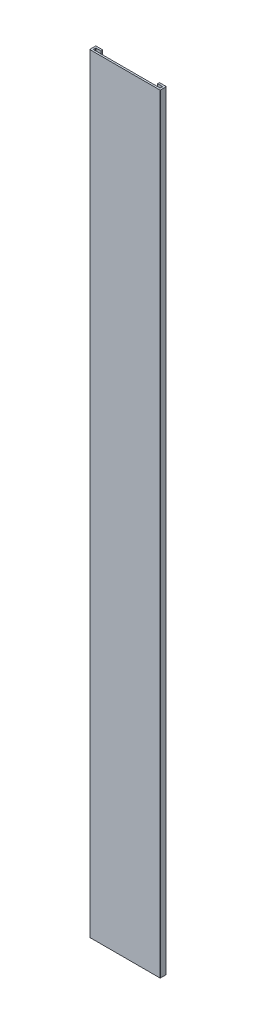
ISO-10303-21;
HEADER;
FILE_DESCRIPTION(('STEP AP214'),'2;1');
FILE_NAME('part.step','',(''),(''),'','','');
FILE_SCHEMA(('AUTOMOTIVE_DESIGN { 1 0 10303 214 1 1 1 1 }'));
ENDSEC;
DATA;
#1=APPLICATION_CONTEXT('core data for automotive mechanical design processes');
#2=APPLICATION_PROTOCOL_DEFINITION('international standard','automotive_design',2000,#1);
#3=PRODUCT_CONTEXT('',#1,'mechanical');
#4=PRODUCT('Part','Part','',(#3));
#5=PRODUCT_RELATED_PRODUCT_CATEGORY('part','',(#4));
#6=PRODUCT_DEFINITION_FORMATION('','',#4);
#7=PRODUCT_DEFINITION_CONTEXT('part definition',#1,'design');
#8=PRODUCT_DEFINITION('design','',#6,#7);
#9=PRODUCT_DEFINITION_SHAPE('','',#8);
#10=(LENGTH_UNIT() NAMED_UNIT(*) SI_UNIT(.MILLI.,.METRE.));
#11=(NAMED_UNIT(*) PLANE_ANGLE_UNIT() SI_UNIT($,.RADIAN.));
#12=(NAMED_UNIT(*) SI_UNIT($,.STERADIAN.) SOLID_ANGLE_UNIT());
#13=UNCERTAINTY_MEASURE_WITH_UNIT(LENGTH_MEASURE(1.E-05),#10,'distance_accuracy_value','');
#14=(GEOMETRIC_REPRESENTATION_CONTEXT(3) GLOBAL_UNCERTAINTY_ASSIGNED_CONTEXT((#13)) GLOBAL_UNIT_ASSIGNED_CONTEXT((#10,
#11,#12)) REPRESENTATION_CONTEXT('',''));
#15=CARTESIAN_POINT('',(0.,0.,0.));
#16=DIRECTION('',(0.,0.,1.));
#17=DIRECTION('',(1.,0.,0.));
#18=AXIS2_PLACEMENT_3D('',#15,#16,#17);
#19=CARTESIAN_POINT('',(17.6613086008675,1000.,2.65));
#20=DIRECTION('',(0.,-1.,0.));
#21=DIRECTION('',(0.,0.,-1.));
#22=AXIS2_PLACEMENT_3D('',#19,#20,#21);
#23=CYLINDRICAL_SURFACE('',#22,0.2);
#24=CARTESIAN_POINT('',(17.6613086008675,423.,2.65));
#25=DIRECTION('',(0.,-1.,0.));
#26=DIRECTION('',(1.,0.,0.));
#27=AXIS2_PLACEMENT_3D('',#24,#25,#26);
#28=CIRCLE('',#27,0.2);
#29=CARTESIAN_POINT('',(17.6613086008675,423.,2.85000000000001));
#30=VERTEX_POINT('',#29);
#31=CARTESIAN_POINT('',(17.8613086008675,423.,2.65));
#32=VERTEX_POINT('',#31);
#33=EDGE_CURVE('E68',#30,#32,#28,.F.);
#34=ORIENTED_EDGE('',*,*,#33,.F.);
#35=DIRECTION('',(0.,-1.,0.));
#36=VECTOR('',#35,1.);
#37=CARTESIAN_POINT('',(17.6613086008675,1000.,2.85));
#38=LINE('',#37,#36);
#39=CARTESIAN_POINT('',(17.6613086008675,0.,2.85));
#40=VERTEX_POINT('',#39);
#41=EDGE_CURVE('E62',#30,#40,#38,.T.);
#42=ORIENTED_EDGE('',*,*,#41,.T.);
#43=CARTESIAN_POINT('',(17.6613086008675,0.,2.65));
#44=DIRECTION('',(0.,-1.,0.));
#45=DIRECTION('',(-1.,0.,0.));
#46=AXIS2_PLACEMENT_3D('',#43,#44,#45);
#47=CIRCLE('',#46,0.2);
#48=CARTESIAN_POINT('',(17.8613086008675,0.,2.65));
#49=VERTEX_POINT('',#48);
#50=EDGE_CURVE('E307',#49,#40,#47,.T.);
#51=ORIENTED_EDGE('',*,*,#50,.F.);
#52=DIRECTION('',(0.,-1.,0.));
#53=VECTOR('',#52,1.);
#54=CARTESIAN_POINT('',(17.8613086008675,1000.,2.65));
#55=LINE('',#54,#53);
#56=EDGE_CURVE('E75',#32,#49,#55,.T.);
#57=ORIENTED_EDGE('',*,*,#56,.F.);
#58=EDGE_LOOP('',(#34,#42,#51,#57));
#59=FACE_BOUND('',#58,.T.);
#60=ADVANCED_FACE('F54',(#59),#23,.T.);
#61=CARTESIAN_POINT('',(17.6613086008675,1000.,2.85));
#62=DIRECTION('',(0.,0.,1.));
#63=DIRECTION('',(1.,0.,0.));
#64=AXIS2_PLACEMENT_3D('',#61,#62,#63);
#65=PLANE('',#64);
#66=DIRECTION('',(1.,0.,0.));
#67=VECTOR('',#66,1.);
#68=CARTESIAN_POINT('',(-247.339658226937,423.,2.85000000000001));
#69=LINE('',#68,#67);
#70=CARTESIAN_POINT('',(-20.7365535308051,423.,2.85000000000001));
#71=VERTEX_POINT('',#70);
#72=EDGE_CURVE('E216',#71,#30,#69,.T.);
#73=ORIENTED_EDGE('',*,*,#72,.F.);
#74=DIRECTION('',(0.,-1.,0.));
#75=VECTOR('',#74,1.);
#76=CARTESIAN_POINT('',(-20.7365535308051,1000.,2.85));
#77=LINE('',#76,#75);
#78=CARTESIAN_POINT('',(-20.7365535308051,0.,2.85));
#79=VERTEX_POINT('',#78);
#80=EDGE_CURVE('E228',#71,#79,#77,.T.);
#81=ORIENTED_EDGE('',*,*,#80,.T.);
#82=DIRECTION('',(-1.,0.,0.));
#83=VECTOR('',#82,1.);
#84=CARTESIAN_POINT('',(17.6613086008675,0.,2.85));
#85=LINE('',#84,#83);
#86=EDGE_CURVE('E311',#40,#79,#85,.T.);
#87=ORIENTED_EDGE('',*,*,#86,.F.);
#88=ORIENTED_EDGE('',*,*,#41,.F.);
#89=EDGE_LOOP('',(#73,#81,#87,#88));
#90=FACE_BOUND('',#89,.T.);
#91=ADVANCED_FACE('F226',(#90),#65,.T.);
#92=CARTESIAN_POINT('',(-20.7365535308051,1000.,2.6478621316727));
#93=DIRECTION('',(0.,-1.,0.));
#94=DIRECTION('',(0.,0.,-1.));
#95=AXIS2_PLACEMENT_3D('',#92,#93,#94);
#96=CYLINDRICAL_SURFACE('',#95,0.202137868327308);
#97=CARTESIAN_POINT('',(-20.7365535308051,423.,2.6478621316727));
#98=DIRECTION('',(0.,-1.,0.));
#99=DIRECTION('',(1.,0.,0.));
#100=AXIS2_PLACEMENT_3D('',#97,#98,#99);
#101=CIRCLE('',#100,0.202137868327308);
#102=CARTESIAN_POINT('',(-20.9386913991324,423.,2.6478621316727));
#103=VERTEX_POINT('',#102);
#104=EDGE_CURVE('E213',#103,#71,#101,.F.);
#105=ORIENTED_EDGE('',*,*,#104,.F.);
#106=DIRECTION('',(0.,-1.,0.));
#107=VECTOR('',#106,1.);
#108=CARTESIAN_POINT('',(-20.9386913991324,1000.,2.6478621316727));
#109=LINE('',#108,#107);
#110=CARTESIAN_POINT('',(-20.9386913991324,0.,2.6478621316727));
#111=VERTEX_POINT('',#110);
#112=EDGE_CURVE('E238',#103,#111,#109,.T.);
#113=ORIENTED_EDGE('',*,*,#112,.T.);
#114=CARTESIAN_POINT('',(-20.7365535308051,0.,2.6478621316727));
#115=DIRECTION('',(0.,-1.,0.));
#116=DIRECTION('',(1.,0.,0.));
#117=AXIS2_PLACEMENT_3D('',#114,#115,#116);
#118=CIRCLE('',#117,0.202137868327308);
#119=EDGE_CURVE('E235',#79,#111,#118,.T.);
#120=ORIENTED_EDGE('',*,*,#119,.F.);
#121=ORIENTED_EDGE('',*,*,#80,.F.);
#122=EDGE_LOOP('',(#105,#113,#120,#121));
#123=FACE_BOUND('',#122,.T.);
#124=ADVANCED_FACE('F233',(#123),#96,.T.);
#125=CARTESIAN_POINT('',(-20.9386913991324,1000.,2.6478621316727));
#126=DIRECTION('',(-1.,0.,0.));
#127=DIRECTION('',(0.,0.,1.));
#128=AXIS2_PLACEMENT_3D('',#125,#126,#127);
#129=PLANE('',#128);
#130=DIRECTION('',(0.,0.,1.));
#131=VECTOR('',#130,1.);
#132=CARTESIAN_POINT('',(-20.9386913991324,423.,2.6478621316727));
#133=LINE('',#132,#131);
#134=CARTESIAN_POINT('',(-20.9386913991324,423.,-0.350017840413514));
#135=VERTEX_POINT('',#134);
#136=EDGE_CURVE('E218',#135,#103,#133,.T.);
#137=ORIENTED_EDGE('',*,*,#136,.F.);
#138=DIRECTION('',(0.,-1.,0.));
#139=VECTOR('',#138,1.);
#140=CARTESIAN_POINT('',(-20.9386913991324,1000.,-0.350017840413514));
#141=LINE('',#140,#139);
#142=CARTESIAN_POINT('',(-20.9386913991324,0.,-0.350017840413514));
#143=VERTEX_POINT('',#142);
#144=EDGE_CURVE('E242',#135,#143,#141,.T.);
#145=ORIENTED_EDGE('',*,*,#144,.T.);
#146=DIRECTION('',(0.,0.,-1.));
#147=VECTOR('',#146,1.);
#148=CARTESIAN_POINT('',(-20.9386913991324,0.,2.6478621316727));
#149=LINE('',#148,#147);
#150=EDGE_CURVE('E390',#111,#143,#149,.T.);
#151=ORIENTED_EDGE('',*,*,#150,.F.);
#152=ORIENTED_EDGE('',*,*,#112,.F.);
#153=EDGE_LOOP('',(#137,#145,#151,#152));
#154=FACE_BOUND('',#153,.T.);
#155=ADVANCED_FACE('F556',(#154),#129,.T.);
#156=CARTESIAN_POINT('',(-20.7386913991324,1000.,-0.350017840413514));
#157=DIRECTION('',(0.,-1.,0.));
#158=DIRECTION('',(0.,0.,-1.));
#159=AXIS2_PLACEMENT_3D('',#156,#157,#158);
#160=CYLINDRICAL_SURFACE('',#159,0.2);
#161=CARTESIAN_POINT('',(-20.7386913991324,423.,-0.350017840413514));
#162=DIRECTION('',(0.,-1.,0.));
#163=DIRECTION('',(1.,0.,0.));
#164=AXIS2_PLACEMENT_3D('',#161,#162,#163);
#165=CIRCLE('',#164,0.2);
#166=CARTESIAN_POINT('',(-20.7387092403416,423.,-0.550017839617743));
#167=VERTEX_POINT('',#166);
#168=EDGE_CURVE('E402',#167,#135,#165,.F.);
#169=ORIENTED_EDGE('',*,*,#168,.F.);
#170=DIRECTION('',(0.,-1.,0.));
#171=VECTOR('',#170,1.);
#172=CARTESIAN_POINT('',(-20.7387092403416,1000.,-0.550017839617742));
#173=LINE('',#172,#171);
#174=CARTESIAN_POINT('',(-20.7387092403416,0.,-0.550017839617742));
#175=VERTEX_POINT('',#174);
#176=EDGE_CURVE('E247',#167,#175,#173,.T.);
#177=ORIENTED_EDGE('',*,*,#176,.T.);
#178=CARTESIAN_POINT('',(-20.7386913991324,0.,-0.350017840413514));
#179=DIRECTION('',(0.,-1.,0.));
#180=DIRECTION('',(1.,0.,0.));
#181=AXIS2_PLACEMENT_3D('',#178,#179,#180);
#182=CIRCLE('',#181,0.2);
#183=EDGE_CURVE('E386',#143,#175,#182,.T.);
#184=ORIENTED_EDGE('',*,*,#183,.F.);
#185=ORIENTED_EDGE('',*,*,#144,.F.);
#186=EDGE_LOOP('',(#169,#177,#184,#185));
#187=FACE_BOUND('',#186,.T.);
#188=ADVANCED_FACE('F553',(#187),#160,.T.);
#189=CARTESIAN_POINT('',(-20.7387092403416,1000.,-0.550017839617743));
#190=DIRECTION('',(-8.92060461032424E-05,0.,-0.999999996021141));
#191=DIRECTION('',(-0.999999996021141,0.,8.92060461032424E-05));
#192=AXIS2_PLACEMENT_3D('',#189,#190,#191);
#193=PLANE('',#192);
#194=DIRECTION('',(-0.999999996021141,0.,8.92060461032424E-05));
#195=VECTOR('',#194,1.);
#196=CARTESIAN_POINT('',(-20.7387092403417,423.,-0.550017839617743));
#197=LINE('',#196,#195);
#198=CARTESIAN_POINT('',(-17.1724261732622,423.,-0.550335973630708));
#199=VERTEX_POINT('',#198);
#200=EDGE_CURVE('E405',#199,#167,#197,.T.);
#201=ORIENTED_EDGE('',*,*,#200,.F.);
#202=DIRECTION('',(0.,-1.,0.));
#203=VECTOR('',#202,1.);
#204=CARTESIAN_POINT('',(-17.1724261732622,1000.,-0.550335973630708));
#205=LINE('',#204,#203);
#206=CARTESIAN_POINT('',(-17.1724261732622,0.,-0.550335973630708));
#207=VERTEX_POINT('',#206);
#208=EDGE_CURVE('E250',#199,#207,#205,.T.);
#209=ORIENTED_EDGE('',*,*,#208,.T.);
#210=DIRECTION('',(0.999999996021141,0.,-8.92060461032424E-05));
#211=VECTOR('',#210,1.);
#212=CARTESIAN_POINT('',(-20.7387092403416,0.,-0.550017839617743));
#213=LINE('',#212,#211);
#214=EDGE_CURVE('E382',#175,#207,#213,.T.);
#215=ORIENTED_EDGE('',*,*,#214,.F.);
#216=ORIENTED_EDGE('',*,*,#176,.F.);
#217=EDGE_LOOP('',(#201,#209,#215,#216));
#218=FACE_BOUND('',#217,.T.);
#219=ADVANCED_FACE('F549',(#218),#193,.T.);
#220=CARTESIAN_POINT('',(-17.172421380223,1000.,-0.496605992753914));
#221=DIRECTION('',(0.,-1.,0.));
#222=DIRECTION('',(0.,0.,-1.));
#223=AXIS2_PLACEMENT_3D('',#220,#221,#222);
#224=CYLINDRICAL_SURFACE('',#223,0.0537299810905782);
#225=CARTESIAN_POINT('',(-17.172421380223,423.,-0.496605992753914));
#226=DIRECTION('',(0.,-1.,0.));
#227=DIRECTION('',(1.,0.,0.));
#228=AXIS2_PLACEMENT_3D('',#225,#226,#227);
#229=CIRCLE('',#228,0.0537299810905782);
#230=CARTESIAN_POINT('',(-17.1186913991324,423.,-0.496605992753914));
#231=VERTEX_POINT('',#230);
#232=EDGE_CURVE('E408',#231,#199,#229,.F.);
#233=ORIENTED_EDGE('',*,*,#232,.F.);
#234=DIRECTION('',(0.,-1.,0.));
#235=VECTOR('',#234,1.);
#236=CARTESIAN_POINT('',(-17.1186913991324,1000.,-0.496605992753914));
#237=LINE('',#236,#235);
#238=CARTESIAN_POINT('',(-17.1186913991324,0.,-0.496605992753914));
#239=VERTEX_POINT('',#238);
#240=EDGE_CURVE('E253',#231,#239,#237,.T.);
#241=ORIENTED_EDGE('',*,*,#240,.T.);
#242=CARTESIAN_POINT('',(-17.172421380223,0.,-0.496605992753914));
#243=DIRECTION('',(0.,-1.,0.));
#244=DIRECTION('',(-1.,0.,0.));
#245=AXIS2_PLACEMENT_3D('',#242,#243,#244);
#246=CIRCLE('',#245,0.0537299810905782);
#247=EDGE_CURVE('E378',#207,#239,#246,.T.);
#248=ORIENTED_EDGE('',*,*,#247,.F.);
#249=ORIENTED_EDGE('',*,*,#208,.F.);
#250=EDGE_LOOP('',(#233,#241,#248,#249));
#251=FACE_BOUND('',#250,.T.);
#252=ADVANCED_FACE('F543',(#251),#224,.T.);
#253=CARTESIAN_POINT('',(-17.1186913991324,1000.,0.395460094911339));
#254=DIRECTION('',(1.,0.,0.));
#255=DIRECTION('',(0.,0.,-1.));
#256=AXIS2_PLACEMENT_3D('',#253,#254,#255);
#257=PLANE('',#256);
#258=DIRECTION('',(0.,0.,-1.));
#259=VECTOR('',#258,1.);
#260=CARTESIAN_POINT('',(-17.1186913991324,423.,0.395460094911339));
#261=LINE('',#260,#259);
#262=CARTESIAN_POINT('',(-17.1186913991324,423.,0.395460094911339));
#263=VERTEX_POINT('',#262);
#264=EDGE_CURVE('E411',#263,#231,#261,.T.);
#265=ORIENTED_EDGE('',*,*,#264,.F.);
#266=DIRECTION('',(0.,-1.,0.));
#267=VECTOR('',#266,1.);
#268=CARTESIAN_POINT('',(-17.1186913991324,1000.,0.395460094911339));
#269=LINE('',#268,#267);
#270=CARTESIAN_POINT('',(-17.1186913991324,0.,0.395460094911339));
#271=VERTEX_POINT('',#270);
#272=EDGE_CURVE('E256',#263,#271,#269,.T.);
#273=ORIENTED_EDGE('',*,*,#272,.T.);
#274=DIRECTION('',(0.,0.,1.));
#275=VECTOR('',#274,1.);
#276=CARTESIAN_POINT('',(-17.1186913991324,0.,0.395460094911339));
#277=LINE('',#276,#275);
#278=EDGE_CURVE('E374',#239,#271,#277,.T.);
#279=ORIENTED_EDGE('',*,*,#278,.F.);
#280=ORIENTED_EDGE('',*,*,#240,.F.);
#281=EDGE_LOOP('',(#265,#273,#279,#280));
#282=FACE_BOUND('',#281,.T.);
#283=ADVANCED_FACE('F539',(#282),#257,.T.);
#284=CARTESIAN_POINT('',(-17.1728953762093,1000.,0.395460094911339));
#285=DIRECTION('',(0.,-1.,0.));
#286=DIRECTION('',(0.,0.,-1.));
#287=AXIS2_PLACEMENT_3D('',#284,#285,#286);
#288=CYLINDRICAL_SURFACE('',#287,0.054203977076882);
#289=CARTESIAN_POINT('',(-17.1728953762093,423.,0.395460094911339));
#290=DIRECTION('',(0.,-1.,0.));
#291=DIRECTION('',(1.,0.,0.));
#292=AXIS2_PLACEMENT_3D('',#289,#290,#291);
#293=CIRCLE('',#292,0.054203977076882);
#294=CARTESIAN_POINT('',(-17.1728905408868,423.,0.449664071772553));
#295=VERTEX_POINT('',#294);
#296=EDGE_CURVE('E414',#295,#263,#293,.F.);
#297=ORIENTED_EDGE('',*,*,#296,.F.);
#298=DIRECTION('',(0.,-1.,0.));
#299=VECTOR('',#298,1.);
#300=CARTESIAN_POINT('',(-17.1728905408869,1000.,0.449664071772552));
#301=LINE('',#300,#299);
#302=CARTESIAN_POINT('',(-17.1728905408869,0.,0.449664071772552));
#303=VERTEX_POINT('',#302);
#304=EDGE_CURVE('E259',#295,#303,#301,.T.);
#305=ORIENTED_EDGE('',*,*,#304,.T.);
#306=CARTESIAN_POINT('',(-17.1728953762093,0.,0.395460094911339));
#307=DIRECTION('',(0.,-1.,0.));
#308=DIRECTION('',(-1.,0.,0.));
#309=AXIS2_PLACEMENT_3D('',#306,#307,#308);
#310=CIRCLE('',#309,0.054203977076882);
#311=EDGE_CURVE('E370',#271,#303,#310,.T.);
#312=ORIENTED_EDGE('',*,*,#311,.F.);
#313=ORIENTED_EDGE('',*,*,#272,.F.);
#314=EDGE_LOOP('',(#297,#305,#312,#313));
#315=FACE_BOUND('',#314,.T.);
#316=ADVANCED_FACE('F533',(#315),#288,.T.);
#317=CARTESIAN_POINT('',(-19.7387092403416,1000.,0.449892958314661));
#318=DIRECTION('',(8.92060461036404E-05,0.,0.999999996021141));
#319=DIRECTION('',(0.999999996021141,0.,-8.92060461036404E-05));
#320=AXIS2_PLACEMENT_3D('',#317,#318,#319);
#321=PLANE('',#320);
#322=DIRECTION('',(0.999999996021141,0.,-8.92060461036404E-05));
#323=VECTOR('',#322,1.);
#324=CARTESIAN_POINT('',(-19.7387092403417,423.,0.449892958314661));
#325=LINE('',#324,#323);
#326=CARTESIAN_POINT('',(-19.7387092403416,423.,0.44989295831466));
#327=VERTEX_POINT('',#326);
#328=EDGE_CURVE('E417',#327,#295,#325,.T.);
#329=ORIENTED_EDGE('',*,*,#328,.F.);
#330=DIRECTION('',(0.,-1.,0.));
#331=VECTOR('',#330,1.);
#332=CARTESIAN_POINT('',(-19.7387092403416,1000.,0.449892958314661));
#333=LINE('',#332,#331);
#334=CARTESIAN_POINT('',(-19.7387092403416,0.,0.449892958314661));
#335=VERTEX_POINT('',#334);
#336=EDGE_CURVE('E262',#327,#335,#333,.T.);
#337=ORIENTED_EDGE('',*,*,#336,.T.);
#338=DIRECTION('',(-0.999999996021141,0.,8.92060461036404E-05));
#339=VECTOR('',#338,1.);
#340=CARTESIAN_POINT('',(-19.7387092403416,0.,0.449892958314661));
#341=LINE('',#340,#339);
#342=EDGE_CURVE('E366',#303,#335,#341,.T.);
#343=ORIENTED_EDGE('',*,*,#342,.F.);
#344=ORIENTED_EDGE('',*,*,#304,.F.);
#345=EDGE_LOOP('',(#329,#337,#343,#344));
#346=FACE_BOUND('',#345,.T.);
#347=ADVANCED_FACE('F529',(#346),#321,.T.);
#348=CARTESIAN_POINT('',(-19.7386913991324,1000.,0.649892957518888));
#349=DIRECTION('',(0.,-1.,0.));
#350=DIRECTION('',(0.,0.,-1.));
#351=AXIS2_PLACEMENT_3D('',#348,#349,#350);
#352=CYLINDRICAL_SURFACE('',#351,0.2);
#353=CARTESIAN_POINT('',(-19.7386913991324,423.,0.649892957518888));
#354=DIRECTION('',(0.,-1.,0.));
#355=DIRECTION('',(1.,0.,0.));
#356=AXIS2_PLACEMENT_3D('',#353,#354,#355);
#357=CIRCLE('',#356,0.2);
#358=CARTESIAN_POINT('',(-19.9386913991324,423.,0.649892957518889));
#359=VERTEX_POINT('',#358);
#360=EDGE_CURVE('E420',#359,#327,#357,.T.);
#361=ORIENTED_EDGE('',*,*,#360,.F.);
#362=DIRECTION('',(0.,-1.,0.));
#363=VECTOR('',#362,1.);
#364=CARTESIAN_POINT('',(-19.9386913991324,1000.,0.649892957518889));
#365=LINE('',#364,#363);
#366=CARTESIAN_POINT('',(-19.9386913991324,0.,0.649892957518889));
#367=VERTEX_POINT('',#366);
#368=EDGE_CURVE('E265',#359,#367,#365,.T.);
#369=ORIENTED_EDGE('',*,*,#368,.T.);
#370=CARTESIAN_POINT('',(-19.7386913991324,0.,0.649892957518888));
#371=DIRECTION('',(0.,1.,0.));
#372=DIRECTION('',(1.,0.,0.));
#373=AXIS2_PLACEMENT_3D('',#370,#371,#372);
#374=CIRCLE('',#373,0.2);
#375=EDGE_CURVE('E362',#335,#367,#374,.T.);
#376=ORIENTED_EDGE('',*,*,#375,.F.);
#377=ORIENTED_EDGE('',*,*,#336,.F.);
#378=EDGE_LOOP('',(#361,#369,#376,#377));
#379=FACE_BOUND('',#378,.T.);
#380=ADVANCED_FACE('F523',(#379),#352,.F.);
#381=CARTESIAN_POINT('',(-19.9386913991324,1000.,1.75978827643367));
#382=DIRECTION('',(1.,0.,0.));
#383=DIRECTION('',(0.,0.,-1.));
#384=AXIS2_PLACEMENT_3D('',#381,#382,#383);
#385=PLANE('',#384);
#386=DIRECTION('',(0.,0.,-1.));
#387=VECTOR('',#386,1.);
#388=CARTESIAN_POINT('',(-19.9386913991324,423.,1.75978827643367));
#389=LINE('',#388,#387);
#390=CARTESIAN_POINT('',(-19.9386913991324,423.,1.75978827643367));
#391=VERTEX_POINT('',#390);
#392=EDGE_CURVE('E423',#391,#359,#389,.T.);
#393=ORIENTED_EDGE('',*,*,#392,.F.);
#394=DIRECTION('',(0.,-1.,0.));
#395=VECTOR('',#394,1.);
#396=CARTESIAN_POINT('',(-19.9386913991324,1000.,1.75978827643367));
#397=LINE('',#396,#395);
#398=CARTESIAN_POINT('',(-19.9386913991324,0.,1.75978827643367));
#399=VERTEX_POINT('',#398);
#400=EDGE_CURVE('E268',#391,#399,#397,.T.);
#401=ORIENTED_EDGE('',*,*,#400,.T.);
#402=DIRECTION('',(0.,0.,1.));
#403=VECTOR('',#402,1.);
#404=CARTESIAN_POINT('',(-19.9386913991324,0.,1.75978827643367));
#405=LINE('',#404,#403);
#406=EDGE_CURVE('E358',#367,#399,#405,.T.);
#407=ORIENTED_EDGE('',*,*,#406,.F.);
#408=ORIENTED_EDGE('',*,*,#368,.F.);
#409=EDGE_LOOP('',(#393,#401,#407,#408));
#410=FACE_BOUND('',#409,.T.);
#411=ADVANCED_FACE('F519',(#410),#385,.T.);
#412=CARTESIAN_POINT('',(-19.8484796755661,1000.,1.75978827643367));
#413=DIRECTION('',(0.,-1.,0.));
#414=DIRECTION('',(0.,0.,-1.));
#415=AXIS2_PLACEMENT_3D('',#412,#413,#414);
#416=CYLINDRICAL_SURFACE('',#415,0.0902117235663378);
#417=CARTESIAN_POINT('',(-19.8484796755661,423.,1.75978827643367));
#418=DIRECTION('',(0.,-1.,0.));
#419=DIRECTION('',(1.,0.,0.));
#420=AXIS2_PLACEMENT_3D('',#417,#418,#419);
#421=CIRCLE('',#420,0.0902117235663378);
#422=CARTESIAN_POINT('',(-19.8484796755661,423.,1.85000000000001));
#423=VERTEX_POINT('',#422);
#424=EDGE_CURVE('E426',#423,#391,#421,.T.);
#425=ORIENTED_EDGE('',*,*,#424,.F.);
#426=DIRECTION('',(0.,-1.,0.));
#427=VECTOR('',#426,1.);
#428=CARTESIAN_POINT('',(-19.8484796755661,1000.,1.85));
#429=LINE('',#428,#427);
#430=CARTESIAN_POINT('',(-19.8484796755661,0.,1.85));
#431=VERTEX_POINT('',#430);
#432=EDGE_CURVE('E271',#423,#431,#429,.T.);
#433=ORIENTED_EDGE('',*,*,#432,.T.);
#434=CARTESIAN_POINT('',(-19.8484796755661,0.,1.75978827643367));
#435=DIRECTION('',(0.,1.,0.));
#436=DIRECTION('',(1.,0.,0.));
#437=AXIS2_PLACEMENT_3D('',#434,#435,#436);
#438=CIRCLE('',#437,0.0902117235663378);
#439=EDGE_CURVE('E354',#399,#431,#438,.T.);
#440=ORIENTED_EDGE('',*,*,#439,.F.);
#441=ORIENTED_EDGE('',*,*,#400,.F.);
#442=EDGE_LOOP('',(#425,#433,#440,#441));
#443=FACE_BOUND('',#442,.T.);
#444=ADVANCED_FACE('F513',(#443),#416,.F.);
#445=CARTESIAN_POINT('',(16.6613086008675,1000.,1.85));
#446=DIRECTION('',(0.,0.,-1.));
#447=DIRECTION('',(-1.,0.,0.));
#448=AXIS2_PLACEMENT_3D('',#445,#446,#447);
#449=PLANE('',#448);
#450=DIRECTION('',(-1.,0.,0.));
#451=VECTOR('',#450,1.);
#452=CARTESIAN_POINT('',(16.6613086008674,423.,1.85));
#453=LINE('',#452,#451);
#454=CARTESIAN_POINT('',(16.6613086008675,423.,1.85));
#455=VERTEX_POINT('',#454);
#456=EDGE_CURVE('E429',#455,#423,#453,.T.);
#457=ORIENTED_EDGE('',*,*,#456,.F.);
#458=DIRECTION('',(0.,-1.,0.));
#459=VECTOR('',#458,1.);
#460=CARTESIAN_POINT('',(16.6613086008675,1000.,1.85));
#461=LINE('',#460,#459);
#462=CARTESIAN_POINT('',(16.6613086008675,0.,1.85));
#463=VERTEX_POINT('',#462);
#464=EDGE_CURVE('E274',#455,#463,#461,.T.);
#465=ORIENTED_EDGE('',*,*,#464,.T.);
#466=DIRECTION('',(1.,0.,0.));
#467=VECTOR('',#466,1.);
#468=CARTESIAN_POINT('',(16.6613086008675,0.,1.85));
#469=LINE('',#468,#467);
#470=EDGE_CURVE('E350',#431,#463,#469,.T.);
#471=ORIENTED_EDGE('',*,*,#470,.F.);
#472=ORIENTED_EDGE('',*,*,#432,.F.);
#473=EDGE_LOOP('',(#457,#465,#471,#472));
#474=FACE_BOUND('',#473,.T.);
#475=ADVANCED_FACE('F509',(#474),#449,.T.);
#476=CARTESIAN_POINT('',(16.6613086008675,1000.,1.65));
#477=DIRECTION('',(0.,-1.,0.));
#478=DIRECTION('',(0.,0.,-1.));
#479=AXIS2_PLACEMENT_3D('',#476,#477,#478);
#480=CYLINDRICAL_SURFACE('',#479,0.2);
#481=CARTESIAN_POINT('',(16.6613086008675,423.,1.65));
#482=DIRECTION('',(0.,-1.,0.));
#483=DIRECTION('',(1.,0.,0.));
#484=AXIS2_PLACEMENT_3D('',#481,#482,#483);
#485=CIRCLE('',#484,0.2);
#486=CARTESIAN_POINT('',(16.8613086008675,423.,1.65));
#487=VERTEX_POINT('',#486);
#488=EDGE_CURVE('E432',#487,#455,#485,.T.);
#489=ORIENTED_EDGE('',*,*,#488,.F.);
#490=DIRECTION('',(0.,-1.,0.));
#491=VECTOR('',#490,1.);
#492=CARTESIAN_POINT('',(16.8613086008675,1000.,1.65));
#493=LINE('',#492,#491);
#494=CARTESIAN_POINT('',(16.8613086008675,0.,1.65));
#495=VERTEX_POINT('',#494);
#496=EDGE_CURVE('E277',#487,#495,#493,.T.);
#497=ORIENTED_EDGE('',*,*,#496,.T.);
#498=CARTESIAN_POINT('',(16.6613086008675,0.,1.65));
#499=DIRECTION('',(0.,1.,0.));
#500=DIRECTION('',(-1.,0.,0.));
#501=AXIS2_PLACEMENT_3D('',#498,#499,#500);
#502=CIRCLE('',#501,0.2);
#503=EDGE_CURVE('E346',#463,#495,#502,.T.);
#504=ORIENTED_EDGE('',*,*,#503,.F.);
#505=ORIENTED_EDGE('',*,*,#464,.F.);
#506=EDGE_LOOP('',(#489,#497,#504,#505));
#507=FACE_BOUND('',#506,.T.);
#508=ADVANCED_FACE('F503',(#507),#480,.F.);
#509=CARTESIAN_POINT('',(16.8613086008675,1000.,0.65));
#510=DIRECTION('',(-1.,0.,0.));
#511=DIRECTION('',(0.,0.,1.));
#512=AXIS2_PLACEMENT_3D('',#509,#510,#511);
#513=PLANE('',#512);
#514=DIRECTION('',(0.,0.,1.));
#515=VECTOR('',#514,1.);
#516=CARTESIAN_POINT('',(16.8613086008675,423.,0.65));
#517=LINE('',#516,#515);
#518=CARTESIAN_POINT('',(16.8613086008675,423.,0.65));
#519=VERTEX_POINT('',#518);
#520=EDGE_CURVE('E435',#519,#487,#517,.T.);
#521=ORIENTED_EDGE('',*,*,#520,.F.);
#522=DIRECTION('',(0.,-1.,0.));
#523=VECTOR('',#522,1.);
#524=CARTESIAN_POINT('',(16.8613086008675,1000.,0.65));
#525=LINE('',#524,#523);
#526=CARTESIAN_POINT('',(16.8613086008675,0.,0.65));
#527=VERTEX_POINT('',#526);
#528=EDGE_CURVE('E280',#519,#527,#525,.T.);
#529=ORIENTED_EDGE('',*,*,#528,.T.);
#530=DIRECTION('',(0.,0.,-1.));
#531=VECTOR('',#530,1.);
#532=CARTESIAN_POINT('',(16.8613086008675,0.,0.65));
#533=LINE('',#532,#531);
#534=EDGE_CURVE('E342',#495,#527,#533,.T.);
#535=ORIENTED_EDGE('',*,*,#534,.F.);
#536=ORIENTED_EDGE('',*,*,#496,.F.);
#537=EDGE_LOOP('',(#521,#529,#535,#536));
#538=FACE_BOUND('',#537,.T.);
#539=ADVANCED_FACE('F499',(#538),#513,.T.);
#540=CARTESIAN_POINT('',(16.6613086008675,1000.,0.65));
#541=DIRECTION('',(0.,-1.,0.));
#542=DIRECTION('',(0.,0.,-1.));
#543=AXIS2_PLACEMENT_3D('',#540,#541,#542);
#544=CYLINDRICAL_SURFACE('',#543,0.2);
#545=CARTESIAN_POINT('',(16.6613086008675,423.,0.65));
#546=DIRECTION('',(0.,-1.,0.));
#547=DIRECTION('',(1.,0.,0.));
#548=AXIS2_PLACEMENT_3D('',#545,#546,#547);
#549=CIRCLE('',#548,0.2);
#550=CARTESIAN_POINT('',(16.6613086008675,423.,0.45));
#551=VERTEX_POINT('',#550);
#552=EDGE_CURVE('E438',#551,#519,#549,.T.);
#553=ORIENTED_EDGE('',*,*,#552,.F.);
#554=DIRECTION('',(0.,-1.,0.));
#555=VECTOR('',#554,1.);
#556=CARTESIAN_POINT('',(16.6613086008675,1000.,0.45));
#557=LINE('',#556,#555);
#558=CARTESIAN_POINT('',(16.6613086008675,0.,0.45));
#559=VERTEX_POINT('',#558);
#560=EDGE_CURVE('E283',#551,#559,#557,.T.);
#561=ORIENTED_EDGE('',*,*,#560,.T.);
#562=CARTESIAN_POINT('',(16.6613086008675,0.,0.65));
#563=DIRECTION('',(0.,1.,0.));
#564=DIRECTION('',(-1.,0.,0.));
#565=AXIS2_PLACEMENT_3D('',#562,#563,#564);
#566=CIRCLE('',#565,0.2);
#567=EDGE_CURVE('E338',#527,#559,#566,.T.);
#568=ORIENTED_EDGE('',*,*,#567,.F.);
#569=ORIENTED_EDGE('',*,*,#528,.F.);
#570=EDGE_LOOP('',(#553,#561,#568,#569));
#571=FACE_BOUND('',#570,.T.);
#572=ADVANCED_FACE('F493',(#571),#544,.F.);
#573=CARTESIAN_POINT('',(14.0887481119377,1000.,0.45));
#574=DIRECTION('',(0.,0.,1.));
#575=DIRECTION('',(1.,0.,0.));
#576=AXIS2_PLACEMENT_3D('',#573,#574,#575);
#577=PLANE('',#576);
#578=DIRECTION('',(1.,0.,0.));
#579=VECTOR('',#578,1.);
#580=CARTESIAN_POINT('',(14.0887481119377,423.,0.45));
#581=LINE('',#580,#579);
#582=CARTESIAN_POINT('',(14.0887481119377,423.,0.45));
#583=VERTEX_POINT('',#582);
#584=EDGE_CURVE('E441',#583,#551,#581,.T.);
#585=ORIENTED_EDGE('',*,*,#584,.F.);
#586=DIRECTION('',(0.,-1.,0.));
#587=VECTOR('',#586,1.);
#588=CARTESIAN_POINT('',(14.0887481119377,1000.,0.45));
#589=LINE('',#588,#587);
#590=CARTESIAN_POINT('',(14.0887481119377,0.,0.45));
#591=VERTEX_POINT('',#590);
#592=EDGE_CURVE('E286',#583,#591,#589,.T.);
#593=ORIENTED_EDGE('',*,*,#592,.T.);
#594=DIRECTION('',(-1.,0.,0.));
#595=VECTOR('',#594,1.);
#596=CARTESIAN_POINT('',(14.0887481119377,0.,0.45));
#597=LINE('',#596,#595);
#598=EDGE_CURVE('E334',#559,#591,#597,.T.);
#599=ORIENTED_EDGE('',*,*,#598,.F.);
#600=ORIENTED_EDGE('',*,*,#560,.F.);
#601=EDGE_LOOP('',(#585,#593,#599,#600));
#602=FACE_BOUND('',#601,.T.);
#603=ADVANCED_FACE('F489',(#602),#577,.T.);
#604=CARTESIAN_POINT('',(14.0887481119377,1000.,0.4));
#605=DIRECTION('',(0.,-1.,0.));
#606=DIRECTION('',(0.,0.,-1.));
#607=AXIS2_PLACEMENT_3D('',#604,#605,#606);
#608=CYLINDRICAL_SURFACE('',#607,0.05);
#609=CARTESIAN_POINT('',(14.0887481119377,423.,0.4));
#610=DIRECTION('',(0.,-1.,0.));
#611=DIRECTION('',(1.,0.,0.));
#612=AXIS2_PLACEMENT_3D('',#609,#610,#611);
#613=CIRCLE('',#612,0.05);
#614=CARTESIAN_POINT('',(14.0387481119377,423.,0.4));
#615=VERTEX_POINT('',#614);
#616=EDGE_CURVE('E444',#615,#583,#613,.F.);
#617=ORIENTED_EDGE('',*,*,#616,.F.);
#618=DIRECTION('',(0.,-1.,0.));
#619=VECTOR('',#618,1.);
#620=CARTESIAN_POINT('',(14.0387481119377,1000.,0.4));
#621=LINE('',#620,#619);
#622=CARTESIAN_POINT('',(14.0387481119377,0.,0.4));
#623=VERTEX_POINT('',#622);
#624=EDGE_CURVE('E289',#615,#623,#621,.T.);
#625=ORIENTED_EDGE('',*,*,#624,.T.);
#626=CARTESIAN_POINT('',(14.0887481119377,0.,0.4));
#627=DIRECTION('',(0.,-1.,0.));
#628=DIRECTION('',(1.,0.,0.));
#629=AXIS2_PLACEMENT_3D('',#626,#627,#628);
#630=CIRCLE('',#629,0.05);
#631=EDGE_CURVE('E330',#591,#623,#630,.T.);
#632=ORIENTED_EDGE('',*,*,#631,.F.);
#633=ORIENTED_EDGE('',*,*,#592,.F.);
#634=EDGE_LOOP('',(#617,#625,#632,#633));
#635=FACE_BOUND('',#634,.T.);
#636=ADVANCED_FACE('F483',(#635),#608,.T.);
#637=CARTESIAN_POINT('',(14.0387481119377,1000.,0.4));
#638=DIRECTION('',(-1.,0.,0.));
#639=DIRECTION('',(0.,0.,1.));
#640=AXIS2_PLACEMENT_3D('',#637,#638,#639);
#641=PLANE('',#640);
#642=DIRECTION('',(0.,0.,1.));
#643=VECTOR('',#642,1.);
#644=CARTESIAN_POINT('',(14.0387481119377,423.,0.4));
#645=LINE('',#644,#643);
#646=CARTESIAN_POINT('',(14.0387481119377,423.,-0.5));
#647=VERTEX_POINT('',#646);
#648=EDGE_CURVE('E447',#647,#615,#645,.T.);
#649=ORIENTED_EDGE('',*,*,#648,.F.);
#650=DIRECTION('',(0.,-1.,0.));
#651=VECTOR('',#650,1.);
#652=CARTESIAN_POINT('',(14.0387481119377,1000.,-0.5));
#653=LINE('',#652,#651);
#654=CARTESIAN_POINT('',(14.0387481119377,0.,-0.5));
#655=VERTEX_POINT('',#654);
#656=EDGE_CURVE('E292',#647,#655,#653,.T.);
#657=ORIENTED_EDGE('',*,*,#656,.T.);
#658=DIRECTION('',(0.,0.,-1.));
#659=VECTOR('',#658,1.);
#660=CARTESIAN_POINT('',(14.0387481119377,0.,0.4));
#661=LINE('',#660,#659);
#662=EDGE_CURVE('E326',#623,#655,#661,.T.);
#663=ORIENTED_EDGE('',*,*,#662,.F.);
#664=ORIENTED_EDGE('',*,*,#624,.F.);
#665=EDGE_LOOP('',(#649,#657,#663,#664));
#666=FACE_BOUND('',#665,.T.);
#667=ADVANCED_FACE('F480',(#666),#641,.T.);
#668=CARTESIAN_POINT('',(14.0887481119377,1000.,-0.5));
#669=DIRECTION('',(0.,-1.,0.));
#670=DIRECTION('',(0.,0.,-1.));
#671=AXIS2_PLACEMENT_3D('',#668,#669,#670);
#672=CYLINDRICAL_SURFACE('',#671,0.05);
#673=CARTESIAN_POINT('',(14.0887481119377,423.,-0.5));
#674=DIRECTION('',(0.,-1.,0.));
#675=DIRECTION('',(1.,0.,0.));
#676=AXIS2_PLACEMENT_3D('',#673,#674,#675);
#677=CIRCLE('',#676,0.05);
#678=CARTESIAN_POINT('',(14.0887481119377,423.,-0.55));
#679=VERTEX_POINT('',#678);
#680=EDGE_CURVE('E450',#679,#647,#677,.F.);
#681=ORIENTED_EDGE('',*,*,#680,.F.);
#682=DIRECTION('',(0.,-1.,0.));
#683=VECTOR('',#682,1.);
#684=CARTESIAN_POINT('',(14.0887481119377,1000.,-0.55));
#685=LINE('',#684,#683);
#686=CARTESIAN_POINT('',(14.0887481119377,0.,-0.55));
#687=VERTEX_POINT('',#686);
#688=EDGE_CURVE('E295',#679,#687,#685,.T.);
#689=ORIENTED_EDGE('',*,*,#688,.T.);
#690=CARTESIAN_POINT('',(14.0887481119377,0.,-0.5));
#691=DIRECTION('',(0.,-1.,0.));
#692=DIRECTION('',(1.,0.,0.));
#693=AXIS2_PLACEMENT_3D('',#690,#691,#692);
#694=CIRCLE('',#693,0.05);
#695=EDGE_CURVE('E322',#655,#687,#694,.T.);
#696=ORIENTED_EDGE('',*,*,#695,.F.);
#697=ORIENTED_EDGE('',*,*,#656,.F.);
#698=EDGE_LOOP('',(#681,#689,#696,#697));
#699=FACE_BOUND('',#698,.T.);
#700=ADVANCED_FACE('F475',(#699),#672,.T.);
#701=CARTESIAN_POINT('',(14.0887481119377,1000.,-0.55));
#702=DIRECTION('',(0.,0.,-1.));
#703=DIRECTION('',(-1.,0.,0.));
#704=AXIS2_PLACEMENT_3D('',#701,#702,#703);
#705=PLANE('',#704);
#706=DIRECTION('',(-1.,0.,0.));
#707=VECTOR('',#706,1.);
#708=CARTESIAN_POINT('',(14.0887481119377,423.,-0.55));
#709=LINE('',#708,#707);
#710=CARTESIAN_POINT('',(17.6613086008675,423.,-0.55));
#711=VERTEX_POINT('',#710);
#712=EDGE_CURVE('E453',#711,#679,#709,.T.);
#713=ORIENTED_EDGE('',*,*,#712,.F.);
#714=DIRECTION('',(0.,-1.,0.));
#715=VECTOR('',#714,1.);
#716=CARTESIAN_POINT('',(17.6613086008675,1000.,-0.55));
#717=LINE('',#716,#715);
#718=CARTESIAN_POINT('',(17.6613086008675,0.,-0.55));
#719=VERTEX_POINT('',#718);
#720=EDGE_CURVE('E298',#711,#719,#717,.T.);
#721=ORIENTED_EDGE('',*,*,#720,.T.);
#722=DIRECTION('',(1.,0.,0.));
#723=VECTOR('',#722,1.);
#724=CARTESIAN_POINT('',(14.0887481119377,0.,-0.55));
#725=LINE('',#724,#723);
#726=EDGE_CURVE('E318',#687,#719,#725,.T.);
#727=ORIENTED_EDGE('',*,*,#726,.F.);
#728=ORIENTED_EDGE('',*,*,#688,.F.);
#729=EDGE_LOOP('',(#713,#721,#727,#728));
#730=FACE_BOUND('',#729,.T.);
#731=ADVANCED_FACE('F465',(#730),#705,.T.);
#732=CARTESIAN_POINT('',(17.6613086008675,1000.,-0.35));
#733=DIRECTION('',(0.,-1.,0.));
#734=DIRECTION('',(0.,0.,-1.));
#735=AXIS2_PLACEMENT_3D('',#732,#733,#734);
#736=CYLINDRICAL_SURFACE('',#735,0.2);
#737=CARTESIAN_POINT('',(17.6613086008675,423.,-0.35));
#738=DIRECTION('',(0.,-1.,0.));
#739=DIRECTION('',(1.,0.,0.));
#740=AXIS2_PLACEMENT_3D('',#737,#738,#739);
#741=CIRCLE('',#740,0.2);
#742=CARTESIAN_POINT('',(17.8613086008675,423.,-0.35));
#743=VERTEX_POINT('',#742);
#744=EDGE_CURVE('E231',#743,#711,#741,.F.);
#745=ORIENTED_EDGE('',*,*,#744,.F.);
#746=DIRECTION('',(0.,-1.,0.));
#747=VECTOR('',#746,1.);
#748=CARTESIAN_POINT('',(17.8613086008675,1000.,-0.35));
#749=LINE('',#748,#747);
#750=CARTESIAN_POINT('',(17.8613086008675,0.,-0.35));
#751=VERTEX_POINT('',#750);
#752=EDGE_CURVE('E301',#743,#751,#749,.T.);
#753=ORIENTED_EDGE('',*,*,#752,.T.);
#754=CARTESIAN_POINT('',(17.6613086008675,0.,-0.35));
#755=DIRECTION('',(0.,-1.,0.));
#756=DIRECTION('',(-1.,0.,0.));
#757=AXIS2_PLACEMENT_3D('',#754,#755,#756);
#758=CIRCLE('',#757,0.2);
#759=EDGE_CURVE('E314',#719,#751,#758,.T.);
#760=ORIENTED_EDGE('',*,*,#759,.F.);
#761=ORIENTED_EDGE('',*,*,#720,.F.);
#762=EDGE_LOOP('',(#745,#753,#760,#761));
#763=FACE_BOUND('',#762,.T.);
#764=ADVANCED_FACE('F468',(#763),#736,.T.);
#765=CARTESIAN_POINT('',(17.8613086008675,1000.,-0.35));
#766=DIRECTION('',(1.,0.,0.));
#767=DIRECTION('',(0.,0.,-1.));
#768=AXIS2_PLACEMENT_3D('',#765,#766,#767);
#769=PLANE('',#768);
#770=DIRECTION('',(0.,0.,-1.));
#771=VECTOR('',#770,1.);
#772=CARTESIAN_POINT('',(17.8613086008675,423.,-0.35));
#773=LINE('',#772,#771);
#774=EDGE_CURVE('E11',#32,#743,#773,.T.);
#775=ORIENTED_EDGE('',*,*,#774,.F.);
#776=ORIENTED_EDGE('',*,*,#56,.T.);
#777=DIRECTION('',(0.,0.,1.));
#778=VECTOR('',#777,1.);
#779=CARTESIAN_POINT('',(17.8613086008675,0.,-0.35));
#780=LINE('',#779,#778);
#781=EDGE_CURVE('E306',#751,#49,#780,.T.);
#782=ORIENTED_EDGE('',*,*,#781,.F.);
#783=ORIENTED_EDGE('',*,*,#752,.F.);
#784=EDGE_LOOP('',(#775,#776,#782,#783));
#785=FACE_BOUND('',#784,.T.);
#786=ADVANCED_FACE('F610',(#785),#769,.T.);
#787=CARTESIAN_POINT('',(17.6613086008675,0.,2.65));
#788=DIRECTION('',(0.,-1.,0.));
#789=DIRECTION('',(0.,0.,-1.));
#790=AXIS2_PLACEMENT_3D('',#787,#788,#789);
#791=PLANE('',#790);
#792=ORIENTED_EDGE('',*,*,#50,.T.);
#793=ORIENTED_EDGE('',*,*,#86,.T.);
#794=ORIENTED_EDGE('',*,*,#119,.T.);
#795=ORIENTED_EDGE('',*,*,#150,.T.);
#796=ORIENTED_EDGE('',*,*,#183,.T.);
#797=ORIENTED_EDGE('',*,*,#214,.T.);
#798=ORIENTED_EDGE('',*,*,#247,.T.);
#799=ORIENTED_EDGE('',*,*,#278,.T.);
#800=ORIENTED_EDGE('',*,*,#311,.T.);
#801=ORIENTED_EDGE('',*,*,#342,.T.);
#802=ORIENTED_EDGE('',*,*,#375,.T.);
#803=ORIENTED_EDGE('',*,*,#406,.T.);
#804=ORIENTED_EDGE('',*,*,#439,.T.);
#805=ORIENTED_EDGE('',*,*,#470,.T.);
#806=ORIENTED_EDGE('',*,*,#503,.T.);
#807=ORIENTED_EDGE('',*,*,#534,.T.);
#808=ORIENTED_EDGE('',*,*,#567,.T.);
#809=ORIENTED_EDGE('',*,*,#598,.T.);
#810=ORIENTED_EDGE('',*,*,#631,.T.);
#811=ORIENTED_EDGE('',*,*,#662,.T.);
#812=ORIENTED_EDGE('',*,*,#695,.T.);
#813=ORIENTED_EDGE('',*,*,#726,.T.);
#814=ORIENTED_EDGE('',*,*,#759,.T.);
#815=ORIENTED_EDGE('',*,*,#781,.T.);
#816=EDGE_LOOP('',(#792,#793,#794,#795,#796,#797,#798,#799,#800,#801,#802,#803,#804,#805,#806,
#807,#808,#809,#810,#811,#812,#813,#814,#815));
#817=FACE_BOUND('',#816,.T.);
#818=ADVANCED_FACE('F470',(#817),#791,.T.);
#819=CARTESIAN_POINT('',(-247.339658226937,423.,-139.15));
#820=DIRECTION('',(0.,-1.,0.));
#821=DIRECTION('',(1.,0.,0.));
#822=AXIS2_PLACEMENT_3D('',#819,#820,#821);
#823=PLANE('',#822);
#824=ORIENTED_EDGE('',*,*,#33,.T.);
#825=ORIENTED_EDGE('',*,*,#774,.T.);
#826=ORIENTED_EDGE('',*,*,#744,.T.);
#827=ORIENTED_EDGE('',*,*,#712,.T.);
#828=ORIENTED_EDGE('',*,*,#680,.T.);
#829=ORIENTED_EDGE('',*,*,#648,.T.);
#830=ORIENTED_EDGE('',*,*,#616,.T.);
#831=ORIENTED_EDGE('',*,*,#584,.T.);
#832=ORIENTED_EDGE('',*,*,#552,.T.);
#833=ORIENTED_EDGE('',*,*,#520,.T.);
#834=ORIENTED_EDGE('',*,*,#488,.T.);
#835=ORIENTED_EDGE('',*,*,#456,.T.);
#836=ORIENTED_EDGE('',*,*,#424,.T.);
#837=ORIENTED_EDGE('',*,*,#392,.T.);
#838=ORIENTED_EDGE('',*,*,#360,.T.);
#839=ORIENTED_EDGE('',*,*,#328,.T.);
#840=ORIENTED_EDGE('',*,*,#296,.T.);
#841=ORIENTED_EDGE('',*,*,#264,.T.);
#842=ORIENTED_EDGE('',*,*,#232,.T.);
#843=ORIENTED_EDGE('',*,*,#200,.T.);
#844=ORIENTED_EDGE('',*,*,#168,.T.);
#845=ORIENTED_EDGE('',*,*,#136,.T.);
#846=ORIENTED_EDGE('',*,*,#104,.T.);
#847=ORIENTED_EDGE('',*,*,#72,.T.);
#848=EDGE_LOOP('',(#824,#825,#826,#827,#828,#829,#830,#831,#832,#833,#834,#835,#836,#837,#838,
#839,#840,#841,#842,#843,#844,#845,#846,#847));
#849=FACE_BOUND('',#848,.T.);
#850=ADVANCED_FACE('F215',(#849),#823,.F.);
#851=CLOSED_SHELL('',(#60,#91,#124,#155,#188,#219,#252,#283,#316,#347,#380,#411,#444,#475,#508,
#539,#572,#603,#636,#667,#700,#731,#764,#786,#818,#850));
#852=MANIFOLD_SOLID_BREP('B2',#851);
#853=ADVANCED_BREP_SHAPE_REPRESENTATION('',(#18,#852),#14);
#854=SHAPE_DEFINITION_REPRESENTATION(#9,#853);
ENDSEC;
END-ISO-10303-21;
